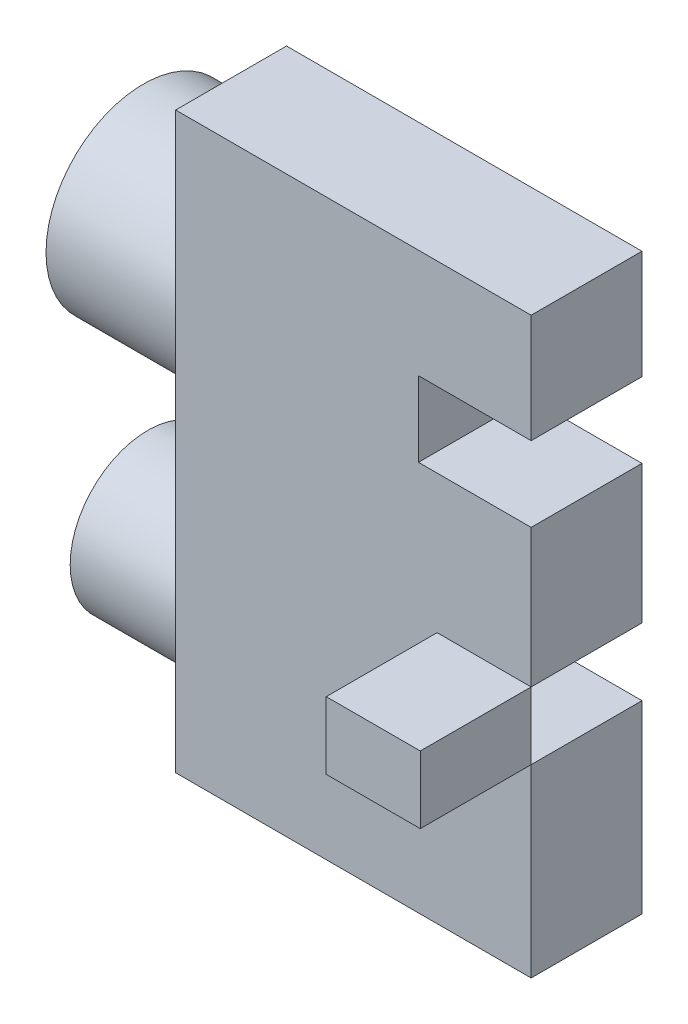
ISO-10303-21;
HEADER;
FILE_DESCRIPTION(('STEP AP214'),'2;1');
FILE_NAME('part.step','',(''),(''),'','','');
FILE_SCHEMA(('AUTOMOTIVE_DESIGN { 1 0 10303 214 1 1 1 1 }'));
ENDSEC;
DATA;
#1=APPLICATION_CONTEXT('core data for automotive mechanical design processes');
#2=APPLICATION_PROTOCOL_DEFINITION('international standard','automotive_design',2000,#1);
#3=PRODUCT_CONTEXT('',#1,'mechanical');
#4=PRODUCT('Part','Part','',(#3));
#5=PRODUCT_RELATED_PRODUCT_CATEGORY('part','',(#4));
#6=PRODUCT_DEFINITION_FORMATION('','',#4);
#7=PRODUCT_DEFINITION_CONTEXT('part definition',#1,'design');
#8=PRODUCT_DEFINITION('design','',#6,#7);
#9=PRODUCT_DEFINITION_SHAPE('','',#8);
#10=(LENGTH_UNIT() NAMED_UNIT(*) SI_UNIT(.MILLI.,.METRE.));
#11=(NAMED_UNIT(*) PLANE_ANGLE_UNIT() SI_UNIT($,.RADIAN.));
#12=(NAMED_UNIT(*) SI_UNIT($,.STERADIAN.) SOLID_ANGLE_UNIT());
#13=UNCERTAINTY_MEASURE_WITH_UNIT(LENGTH_MEASURE(1.E-05),#10,'distance_accuracy_value','');
#14=(GEOMETRIC_REPRESENTATION_CONTEXT(3) GLOBAL_UNCERTAINTY_ASSIGNED_CONTEXT((#13)) GLOBAL_UNIT_ASSIGNED_CONTEXT((#10,
#11,#12)) REPRESENTATION_CONTEXT('',''));
#15=CARTESIAN_POINT('',(0.,0.,0.));
#16=DIRECTION('',(0.,0.,1.));
#17=DIRECTION('',(1.,0.,0.));
#18=AXIS2_PLACEMENT_3D('',#15,#16,#17);
#19=CARTESIAN_POINT('',(23.5831974555638,0.,20.));
#20=DIRECTION('',(1.,0.,0.));
#21=DIRECTION('',(0.,0.,-1.));
#22=AXIS2_PLACEMENT_3D('',#19,#20,#21);
#23=PLANE('',#22);
#24=DIRECTION('',(0.,-1.,0.));
#25=VECTOR('',#24,1.);
#26=CARTESIAN_POINT('',(23.5831974555638,0.,10.));
#27=LINE('',#26,#25);
#28=CARTESIAN_POINT('',(23.5831974555638,22.738119592874,10.));
#29=VERTEX_POINT('',#28);
#30=CARTESIAN_POINT('',(23.5831974555638,16.6677298290869,10.));
#31=VERTEX_POINT('',#30);
#32=EDGE_CURVE('E114',#29,#31,#27,.T.);
#33=ORIENTED_EDGE('',*,*,#32,.T.);
#34=DIRECTION('',(0.,0.,-1.));
#35=VECTOR('',#34,1.);
#36=CARTESIAN_POINT('',(23.5831974555638,16.6677298290869,20.));
#37=LINE('',#36,#35);
#38=CARTESIAN_POINT('',(23.5831974555638,16.6677298290869,20.));
#39=VERTEX_POINT('',#38);
#40=EDGE_CURVE('E12',#39,#31,#37,.T.);
#41=ORIENTED_EDGE('',*,*,#40,.F.);
#42=DIRECTION('',(0.,-1.,0.));
#43=VECTOR('',#42,1.);
#44=CARTESIAN_POINT('',(23.5831974555638,0.,20.));
#45=LINE('',#44,#43);
#46=CARTESIAN_POINT('',(23.5831974555638,22.738119592874,20.));
#47=VERTEX_POINT('',#46);
#48=EDGE_CURVE('E100',#47,#39,#45,.T.);
#49=ORIENTED_EDGE('',*,*,#48,.F.);
#50=DIRECTION('',(0.,0.,-1.));
#51=VECTOR('',#50,1.);
#52=CARTESIAN_POINT('',(23.5831974555638,22.738119592874,20.));
#53=LINE('',#52,#51);
#54=EDGE_CURVE('E67',#47,#29,#53,.T.);
#55=ORIENTED_EDGE('',*,*,#54,.T.);
#56=EDGE_LOOP('',(#33,#41,#49,#55));
#57=FACE_BOUND('',#56,.T.);
#58=ADVANCED_FACE('F51',(#57),#23,.F.);
#59=CARTESIAN_POINT('',(0.,16.6677298290869,20.));
#60=DIRECTION('',(0.,1.,0.));
#61=DIRECTION('',(0.,0.,1.));
#62=AXIS2_PLACEMENT_3D('',#59,#60,#61);
#63=PLANE('',#62);
#64=DIRECTION('',(1.,0.,0.));
#65=VECTOR('',#64,1.);
#66=CARTESIAN_POINT('',(0.,16.6677298290869,10.));
#67=LINE('',#66,#65);
#68=CARTESIAN_POINT('',(32.0668673524223,16.6677298290869,10.));
#69=VERTEX_POINT('',#68);
#70=EDGE_CURVE('E105',#31,#69,#67,.T.);
#71=ORIENTED_EDGE('',*,*,#70,.T.);
#72=DIRECTION('',(0.,0.,-1.));
#73=VECTOR('',#72,1.);
#74=CARTESIAN_POINT('',(32.0668673524223,16.6677298290869,20.));
#75=LINE('',#74,#73);
#76=CARTESIAN_POINT('',(32.0668673524223,16.6677298290869,20.));
#77=VERTEX_POINT('',#76);
#78=EDGE_CURVE('E59',#77,#69,#75,.T.);
#79=ORIENTED_EDGE('',*,*,#78,.F.);
#80=DIRECTION('',(1.,0.,0.));
#81=VECTOR('',#80,1.);
#82=CARTESIAN_POINT('',(0.,16.6677298290869,20.));
#83=LINE('',#82,#81);
#84=EDGE_CURVE('E93',#39,#77,#83,.T.);
#85=ORIENTED_EDGE('',*,*,#84,.F.);
#86=ORIENTED_EDGE('',*,*,#40,.T.);
#87=EDGE_LOOP('',(#71,#79,#85,#86));
#88=FACE_BOUND('',#87,.T.);
#89=ADVANCED_FACE('F104',(#88),#63,.F.);
#90=CARTESIAN_POINT('',(32.0668673524223,0.,20.));
#91=DIRECTION('',(-1.,0.,0.));
#92=DIRECTION('',(0.,0.,1.));
#93=AXIS2_PLACEMENT_3D('',#90,#91,#92);
#94=PLANE('',#93);
#95=DIRECTION('',(0.,1.,0.));
#96=VECTOR('',#95,1.);
#97=CARTESIAN_POINT('',(32.0668673524223,0.,10.));
#98=LINE('',#97,#96);
#99=CARTESIAN_POINT('',(32.0668673524223,22.738119592874,10.));
#100=VERTEX_POINT('',#99);
#101=EDGE_CURVE('E117',#69,#100,#98,.T.);
#102=ORIENTED_EDGE('',*,*,#101,.T.);
#103=DIRECTION('',(0.,0.,-1.));
#104=VECTOR('',#103,1.);
#105=CARTESIAN_POINT('',(32.0668673524223,22.738119592874,20.));
#106=LINE('',#105,#104);
#107=CARTESIAN_POINT('',(32.0668673524223,22.738119592874,20.));
#108=VERTEX_POINT('',#107);
#109=EDGE_CURVE('E82',#108,#100,#106,.T.);
#110=ORIENTED_EDGE('',*,*,#109,.F.);
#111=DIRECTION('',(0.,1.,0.));
#112=VECTOR('',#111,1.);
#113=CARTESIAN_POINT('',(32.0668673524223,0.,20.));
#114=LINE('',#113,#112);
#115=EDGE_CURVE('E99',#77,#108,#114,.T.);
#116=ORIENTED_EDGE('',*,*,#115,.F.);
#117=ORIENTED_EDGE('',*,*,#78,.T.);
#118=EDGE_LOOP('',(#102,#110,#116,#117));
#119=FACE_BOUND('',#118,.T.);
#120=ADVANCED_FACE('F108',(#119),#94,.F.);
#121=CARTESIAN_POINT('',(0.,22.738119592874,20.));
#122=DIRECTION('',(0.,1.,0.));
#123=DIRECTION('',(0.,0.,1.));
#124=AXIS2_PLACEMENT_3D('',#121,#122,#123);
#125=PLANE('',#124);
#126=DIRECTION('',(1.,0.,0.));
#127=VECTOR('',#126,1.);
#128=CARTESIAN_POINT('',(0.,22.738119592874,10.));
#129=LINE('',#128,#127);
#130=EDGE_CURVE('E119',#29,#100,#129,.T.);
#131=ORIENTED_EDGE('',*,*,#130,.F.);
#132=ORIENTED_EDGE('',*,*,#54,.F.);
#133=DIRECTION('',(1.,0.,0.));
#134=VECTOR('',#133,1.);
#135=CARTESIAN_POINT('',(0.,22.738119592874,20.));
#136=LINE('',#135,#134);
#137=EDGE_CURVE('E109',#47,#108,#136,.T.);
#138=ORIENTED_EDGE('',*,*,#137,.T.);
#139=ORIENTED_EDGE('',*,*,#109,.T.);
#140=EDGE_LOOP('',(#131,#132,#138,#139));
#141=FACE_BOUND('',#140,.T.);
#142=ADVANCED_FACE('F125',(#141),#125,.T.);
#143=CARTESIAN_POINT('',(0.,0.,20.));
#144=DIRECTION('',(0.,0.,1.));
#145=DIRECTION('',(1.,0.,0.));
#146=AXIS2_PLACEMENT_3D('',#143,#144,#145);
#147=PLANE('',#146);
#148=ORIENTED_EDGE('',*,*,#48,.T.);
#149=ORIENTED_EDGE('',*,*,#84,.T.);
#150=ORIENTED_EDGE('',*,*,#115,.T.);
#151=ORIENTED_EDGE('',*,*,#137,.F.);
#152=EDGE_LOOP('',(#148,#149,#150,#151));
#153=FACE_BOUND('',#152,.T.);
#154=ADVANCED_FACE('F96',(#153),#147,.T.);
#155=CARTESIAN_POINT('',(0.,0.,10.));
#156=DIRECTION('',(0.,0.,1.));
#157=DIRECTION('',(1.,0.,0.));
#158=AXIS2_PLACEMENT_3D('',#155,#156,#157);
#159=PLANE('',#158);
#160=ORIENTED_EDGE('',*,*,#32,.F.);
#161=ORIENTED_EDGE('',*,*,#130,.T.);
#162=ORIENTED_EDGE('',*,*,#101,.F.);
#163=ORIENTED_EDGE('',*,*,#70,.F.);
#164=EDGE_LOOP('',(#160,#161,#162,#163));
#165=FACE_BOUND('',#164,.T.);
#166=ADVANCED_FACE('F124',(#165),#159,.F.);
#167=CLOSED_SHELL('',(#58,#89,#120,#142,#154,#166));
#168=MANIFOLD_SOLID_BREP('B2',#167);
#169=CARTESIAN_POINT('',(32.0668673524223,51.7801054789113,10.));
#170=DIRECTION('',(-1.,0.,0.));
#171=DIRECTION('',(0.,0.,1.));
#172=AXIS2_PLACEMENT_3D('',#169,#170,#171);
#173=PLANE('',#172);
#174=DIRECTION('',(0.,0.,1.));
#175=VECTOR('',#174,1.);
#176=CARTESIAN_POINT('',(32.0668673524223,41.9765856134915,0.));
#177=LINE('',#176,#175);
#178=CARTESIAN_POINT('',(32.0668673524223,41.9765856134915,0.));
#179=VERTEX_POINT('',#178);
#180=CARTESIAN_POINT('',(32.0668673524223,41.9765856134915,10.));
#181=VERTEX_POINT('',#180);
#182=EDGE_CURVE('E322',#179,#181,#177,.T.);
#183=ORIENTED_EDGE('',*,*,#182,.F.);
#184=DIRECTION('',(0.,1.,0.));
#185=VECTOR('',#184,1.);
#186=CARTESIAN_POINT('',(32.0668673524223,51.7801054789113,0.));
#187=LINE('',#186,#185);
#188=CARTESIAN_POINT('',(32.0668673524223,51.7801054789113,0.));
#189=VERTEX_POINT('',#188);
#190=EDGE_CURVE('E399',#179,#189,#187,.T.);
#191=ORIENTED_EDGE('',*,*,#190,.T.);
#192=DIRECTION('',(0.,0.,-1.));
#193=VECTOR('',#192,1.);
#194=CARTESIAN_POINT('',(32.0668673524223,51.7801054789113,10.));
#195=LINE('',#194,#193);
#196=CARTESIAN_POINT('',(32.0668673524223,51.7801054789113,10.));
#197=VERTEX_POINT('',#196);
#198=EDGE_CURVE('E410',#197,#189,#195,.T.);
#199=ORIENTED_EDGE('',*,*,#198,.F.);
#200=DIRECTION('',(0.,1.,0.));
#201=VECTOR('',#200,1.);
#202=CARTESIAN_POINT('',(32.0668673524223,51.7801054789113,10.));
#203=LINE('',#202,#201);
#204=EDGE_CURVE('E382',#181,#197,#203,.T.);
#205=ORIENTED_EDGE('',*,*,#204,.F.);
#206=EDGE_LOOP('',(#183,#191,#199,#205));
#207=FACE_BOUND('',#206,.T.);
#208=ADVANCED_FACE('F178',(#207),#173,.F.);
#209=CARTESIAN_POINT('',(32.0668673524223,22.738119592874,0.));
#210=VERTEX_POINT('',#209);
#211=CARTESIAN_POINT('',(32.0668673524223,35.2057662615751,0.));
#212=VERTEX_POINT('',#211);
#213=EDGE_CURVE('E404',#210,#212,#187,.T.);
#214=ORIENTED_EDGE('',*,*,#213,.T.);
#215=DIRECTION('',(0.,0.,1.));
#216=VECTOR('',#215,1.);
#217=CARTESIAN_POINT('',(32.0668673524223,35.2057662615751,0.));
#218=LINE('',#217,#216);
#219=CARTESIAN_POINT('',(32.0668673524223,35.2057662615751,10.));
#220=VERTEX_POINT('',#219);
#221=EDGE_CURVE('E204',#212,#220,#218,.T.);
#222=ORIENTED_EDGE('',*,*,#221,.T.);
#223=CARTESIAN_POINT('',(32.0668673524223,22.738119592874,10.));
#224=VERTEX_POINT('',#223);
#225=EDGE_CURVE('E388',#224,#220,#203,.T.);
#226=ORIENTED_EDGE('',*,*,#225,.F.);
#227=DIRECTION('',(0.,0.,1.));
#228=VECTOR('',#227,1.);
#229=CARTESIAN_POINT('',(32.0668673524223,22.738119592874,0.));
#230=LINE('',#229,#228);
#231=EDGE_CURVE('E331',#210,#224,#230,.T.);
#232=ORIENTED_EDGE('',*,*,#231,.F.);
#233=EDGE_LOOP('',(#214,#222,#226,#232));
#234=FACE_BOUND('',#233,.T.);
#235=ADVANCED_FACE('F471',(#234),#173,.F.);
#236=CARTESIAN_POINT('',(0.,0.,10.));
#237=DIRECTION('',(0.,0.,-1.));
#238=DIRECTION('',(-1.,0.,0.));
#239=AXIS2_PLACEMENT_3D('',#236,#237,#238);
#240=PLANE('',#239);
#241=DIRECTION('',(1.,0.,0.));
#242=VECTOR('',#241,1.);
#243=CARTESIAN_POINT('',(0.,41.9765856134915,10.));
#244=LINE('',#243,#242);
#245=CARTESIAN_POINT('',(21.9021664440536,41.9765856134915,10.));
#246=VERTEX_POINT('',#245);
#247=EDGE_CURVE('E304',#246,#181,#244,.T.);
#248=ORIENTED_EDGE('',*,*,#247,.T.);
#249=ORIENTED_EDGE('',*,*,#204,.T.);
#250=DIRECTION('',(-1.,0.,0.));
#251=VECTOR('',#250,1.);
#252=CARTESIAN_POINT('',(0.,51.7801054789113,10.));
#253=LINE('',#252,#251);
#254=CARTESIAN_POINT('',(0.,51.7801054789113,10.));
#255=VERTEX_POINT('',#254);
#256=EDGE_CURVE('E387',#197,#255,#253,.T.);
#257=ORIENTED_EDGE('',*,*,#256,.T.);
#258=DIRECTION('',(0.,-1.,0.));
#259=VECTOR('',#258,1.);
#260=CARTESIAN_POINT('',(0.,0.,10.));
#261=LINE('',#260,#259);
#262=CARTESIAN_POINT('',(0.,0.,10.));
#263=VERTEX_POINT('',#262);
#264=EDGE_CURVE('E374',#255,#263,#261,.T.);
#265=ORIENTED_EDGE('',*,*,#264,.T.);
#266=DIRECTION('',(1.,0.,0.));
#267=VECTOR('',#266,1.);
#268=CARTESIAN_POINT('',(0.,0.,10.));
#269=LINE('',#268,#267);
#270=CARTESIAN_POINT('',(32.0668673524223,0.,10.));
#271=VERTEX_POINT('',#270);
#272=EDGE_CURVE('E378',#263,#271,#269,.T.);
#273=ORIENTED_EDGE('',*,*,#272,.T.);
#274=CARTESIAN_POINT('',(32.0668673524223,16.6677298290869,10.));
#275=VERTEX_POINT('',#274);
#276=EDGE_CURVE('E383',#271,#275,#203,.T.);
#277=ORIENTED_EDGE('',*,*,#276,.T.);
#278=DIRECTION('',(1.,0.,0.));
#279=VECTOR('',#278,1.);
#280=CARTESIAN_POINT('',(23.5831974555638,16.6677298290869,10.));
#281=LINE('',#280,#279);
#282=CARTESIAN_POINT('',(23.5831974555638,16.6677298290869,10.));
#283=VERTEX_POINT('',#282);
#284=EDGE_CURVE('E315',#283,#275,#281,.T.);
#285=ORIENTED_EDGE('',*,*,#284,.F.);
#286=DIRECTION('',(0.,-1.,0.));
#287=VECTOR('',#286,1.);
#288=CARTESIAN_POINT('',(23.5831974555638,22.738119592874,10.));
#289=LINE('',#288,#287);
#290=CARTESIAN_POINT('',(23.5831974555638,22.738119592874,10.));
#291=VERTEX_POINT('',#290);
#292=EDGE_CURVE('E340',#291,#283,#289,.T.);
#293=ORIENTED_EDGE('',*,*,#292,.F.);
#294=DIRECTION('',(1.,0.,0.));
#295=VECTOR('',#294,1.);
#296=CARTESIAN_POINT('',(23.5831974555638,22.738119592874,10.));
#297=LINE('',#296,#295);
#298=EDGE_CURVE('E344',#291,#224,#297,.T.);
#299=ORIENTED_EDGE('',*,*,#298,.T.);
#300=ORIENTED_EDGE('',*,*,#225,.T.);
#301=DIRECTION('',(1.,0.,0.));
#302=VECTOR('',#301,1.);
#303=CARTESIAN_POINT('',(0.,35.2057662615751,10.));
#304=LINE('',#303,#302);
#305=CARTESIAN_POINT('',(21.9021664440536,35.2057662615751,10.));
#306=VERTEX_POINT('',#305);
#307=EDGE_CURVE('E308',#306,#220,#304,.T.);
#308=ORIENTED_EDGE('',*,*,#307,.F.);
#309=DIRECTION('',(0.,-1.,0.));
#310=VECTOR('',#309,1.);
#311=CARTESIAN_POINT('',(21.9021664440536,0.,10.));
#312=LINE('',#311,#310);
#313=EDGE_CURVE('E289',#246,#306,#312,.T.);
#314=ORIENTED_EDGE('',*,*,#313,.F.);
#315=EDGE_LOOP('',(#248,#249,#257,#265,#273,#277,#285,#293,#299,#300,#308,#314));
#316=FACE_BOUND('',#315,.T.);
#317=ADVANCED_FACE('F439',(#316),#240,.F.);
#318=CARTESIAN_POINT('',(0.,0.,0.));
#319=DIRECTION('',(0.,0.,-1.));
#320=DIRECTION('',(-1.,0.,0.));
#321=AXIS2_PLACEMENT_3D('',#318,#319,#320);
#322=PLANE('',#321);
#323=ORIENTED_EDGE('',*,*,#190,.F.);
#324=DIRECTION('',(1.,0.,0.));
#325=VECTOR('',#324,1.);
#326=CARTESIAN_POINT('',(0.,41.9765856134915,0.));
#327=LINE('',#326,#325);
#328=CARTESIAN_POINT('',(21.9021664440536,41.9765856134915,0.));
#329=VERTEX_POINT('',#328);
#330=EDGE_CURVE('E292',#329,#179,#327,.T.);
#331=ORIENTED_EDGE('',*,*,#330,.F.);
#332=DIRECTION('',(0.,-1.,0.));
#333=VECTOR('',#332,1.);
#334=CARTESIAN_POINT('',(21.9021664440536,0.,0.));
#335=LINE('',#334,#333);
#336=CARTESIAN_POINT('',(21.9021664440536,35.2057662615751,0.));
#337=VERTEX_POINT('',#336);
#338=EDGE_CURVE('E286',#329,#337,#335,.T.);
#339=ORIENTED_EDGE('',*,*,#338,.T.);
#340=DIRECTION('',(1.,0.,0.));
#341=VECTOR('',#340,1.);
#342=CARTESIAN_POINT('',(0.,35.2057662615751,0.));
#343=LINE('',#342,#341);
#344=EDGE_CURVE('E294',#337,#212,#343,.T.);
#345=ORIENTED_EDGE('',*,*,#344,.T.);
#346=ORIENTED_EDGE('',*,*,#213,.F.);
#347=DIRECTION('',(1.,0.,0.));
#348=VECTOR('',#347,1.);
#349=CARTESIAN_POINT('',(23.5831974555638,22.738119592874,0.));
#350=LINE('',#349,#348);
#351=CARTESIAN_POINT('',(23.5831974555638,22.738119592874,0.));
#352=VERTEX_POINT('',#351);
#353=EDGE_CURVE('E353',#352,#210,#350,.T.);
#354=ORIENTED_EDGE('',*,*,#353,.F.);
#355=DIRECTION('',(0.,-1.,0.));
#356=VECTOR('',#355,1.);
#357=CARTESIAN_POINT('',(23.5831974555638,22.738119592874,0.));
#358=LINE('',#357,#356);
#359=CARTESIAN_POINT('',(23.5831974555638,16.6677298290869,0.));
#360=VERTEX_POINT('',#359);
#361=EDGE_CURVE('E196',#352,#360,#358,.T.);
#362=ORIENTED_EDGE('',*,*,#361,.T.);
#363=DIRECTION('',(1.,0.,0.));
#364=VECTOR('',#363,1.);
#365=CARTESIAN_POINT('',(23.5831974555638,16.6677298290869,0.));
#366=LINE('',#365,#364);
#367=CARTESIAN_POINT('',(32.0668673524223,16.6677298290869,0.));
#368=VERTEX_POINT('',#367);
#369=EDGE_CURVE('E345',#360,#368,#366,.T.);
#370=ORIENTED_EDGE('',*,*,#369,.T.);
#371=CARTESIAN_POINT('',(32.0668673524223,0.,0.));
#372=VERTEX_POINT('',#371);
#373=EDGE_CURVE('E400',#372,#368,#187,.T.);
#374=ORIENTED_EDGE('',*,*,#373,.F.);
#375=DIRECTION('',(1.,0.,0.));
#376=VECTOR('',#375,1.);
#377=CARTESIAN_POINT('',(0.,0.,0.));
#378=LINE('',#377,#376);
#379=CARTESIAN_POINT('',(0.,0.,0.));
#380=VERTEX_POINT('',#379);
#381=EDGE_CURVE('E395',#380,#372,#378,.T.);
#382=ORIENTED_EDGE('',*,*,#381,.F.);
#383=DIRECTION('',(0.,-1.,0.));
#384=VECTOR('',#383,1.);
#385=CARTESIAN_POINT('',(0.,0.,0.));
#386=LINE('',#385,#384);
#387=CARTESIAN_POINT('',(0.,1.49175541961911,0.));
#388=VERTEX_POINT('',#387);
#389=EDGE_CURVE('E373',#388,#380,#386,.T.);
#390=ORIENTED_EDGE('',*,*,#389,.F.);
#391=CARTESIAN_POINT('',(0.,15.5003471822047,0.));
#392=VERTEX_POINT('',#391);
#393=EDGE_CURVE('E433',#392,#388,#386,.T.);
#394=ORIENTED_EDGE('',*,*,#393,.F.);
#395=CARTESIAN_POINT('',(0.,24.7927130513864,0.));
#396=VERTEX_POINT('',#395);
#397=EDGE_CURVE('E452',#396,#392,#386,.T.);
#398=ORIENTED_EDGE('',*,*,#397,.F.);
#399=CARTESIAN_POINT('',(0.,42.3501480604937,0.));
#400=VERTEX_POINT('',#399);
#401=EDGE_CURVE('E396',#400,#396,#386,.T.);
#402=ORIENTED_EDGE('',*,*,#401,.F.);
#403=CARTESIAN_POINT('',(0.,51.7801054789113,0.));
#404=VERTEX_POINT('',#403);
#405=EDGE_CURVE('E392',#404,#400,#386,.T.);
#406=ORIENTED_EDGE('',*,*,#405,.F.);
#407=DIRECTION('',(-1.,0.,0.));
#408=VECTOR('',#407,1.);
#409=CARTESIAN_POINT('',(0.,51.7801054789113,0.));
#410=LINE('',#409,#408);
#411=EDGE_CURVE('E379',#189,#404,#410,.T.);
#412=ORIENTED_EDGE('',*,*,#411,.F.);
#413=EDGE_LOOP('',(#323,#331,#339,#345,#346,#354,#362,#370,#374,#382,#390,#394,#398,#402,#406,#412));
#414=FACE_BOUND('',#413,.T.);
#415=ADVANCED_FACE('F302',(#414),#322,.T.);
#416=CARTESIAN_POINT('',(0.,0.,10.));
#417=DIRECTION('',(1.,0.,0.));
#418=DIRECTION('',(0.,0.,-1.));
#419=AXIS2_PLACEMENT_3D('',#416,#417,#418);
#420=PLANE('',#419);
#421=CARTESIAN_POINT('',(0.,8.4960513009119,0.));
#422=DIRECTION('',(-1.,0.,0.));
#423=DIRECTION('',(0.,0.,1.));
#424=AXIS2_PLACEMENT_3D('',#421,#422,#423);
#425=CIRCLE('',#424,7.00429588129279);
#426=EDGE_CURVE('E321',#388,#392,#425,.T.);
#427=ORIENTED_EDGE('',*,*,#426,.F.);
#428=ORIENTED_EDGE('',*,*,#389,.T.);
#429=DIRECTION('',(0.,0.,-1.));
#430=VECTOR('',#429,1.);
#431=CARTESIAN_POINT('',(0.,0.,10.));
#432=LINE('',#431,#430);
#433=EDGE_CURVE('E182',#263,#380,#432,.T.);
#434=ORIENTED_EDGE('',*,*,#433,.F.);
#435=ORIENTED_EDGE('',*,*,#264,.F.);
#436=DIRECTION('',(0.,0.,-1.));
#437=VECTOR('',#436,1.);
#438=CARTESIAN_POINT('',(0.,51.7801054789113,10.));
#439=LINE('',#438,#437);
#440=EDGE_CURVE('E391',#255,#404,#439,.T.);
#441=ORIENTED_EDGE('',*,*,#440,.T.);
#442=ORIENTED_EDGE('',*,*,#405,.T.);
#443=CARTESIAN_POINT('',(0.,33.5714305559401,0.));
#444=DIRECTION('',(-1.,0.,0.));
#445=DIRECTION('',(0.,0.,1.));
#446=AXIS2_PLACEMENT_3D('',#443,#444,#445);
#447=CIRCLE('',#446,8.77871750455363);
#448=EDGE_CURVE('E49',#396,#400,#447,.T.);
#449=ORIENTED_EDGE('',*,*,#448,.F.);
#450=ORIENTED_EDGE('',*,*,#397,.T.);
#451=EDGE_LOOP('',(#427,#428,#434,#435,#441,#442,#449,#450));
#452=FACE_BOUND('',#451,.T.);
#453=ADVANCED_FACE('F180',(#452),#420,.F.);
#454=CARTESIAN_POINT('',(0.,0.,10.));
#455=DIRECTION('',(0.,1.,0.));
#456=DIRECTION('',(0.,0.,1.));
#457=AXIS2_PLACEMENT_3D('',#454,#455,#456);
#458=PLANE('',#457);
#459=ORIENTED_EDGE('',*,*,#381,.T.);
#460=DIRECTION('',(0.,0.,-1.));
#461=VECTOR('',#460,1.);
#462=CARTESIAN_POINT('',(32.0668673524223,0.,10.));
#463=LINE('',#462,#461);
#464=EDGE_CURVE('E413',#271,#372,#463,.T.);
#465=ORIENTED_EDGE('',*,*,#464,.F.);
#466=ORIENTED_EDGE('',*,*,#272,.F.);
#467=ORIENTED_EDGE('',*,*,#433,.T.);
#468=EDGE_LOOP('',(#459,#465,#466,#467));
#469=FACE_BOUND('',#468,.T.);
#470=ADVANCED_FACE('F424',(#469),#458,.F.);
#471=ORIENTED_EDGE('',*,*,#373,.T.);
#472=DIRECTION('',(0.,0.,1.));
#473=VECTOR('',#472,1.);
#474=CARTESIAN_POINT('',(32.0668673524223,16.6677298290869,0.));
#475=LINE('',#474,#473);
#476=EDGE_CURVE('E327',#368,#275,#475,.T.);
#477=ORIENTED_EDGE('',*,*,#476,.T.);
#478=ORIENTED_EDGE('',*,*,#276,.F.);
#479=ORIENTED_EDGE('',*,*,#464,.T.);
#480=EDGE_LOOP('',(#471,#477,#478,#479));
#481=FACE_BOUND('',#480,.T.);
#482=ADVANCED_FACE('F435',(#481),#173,.F.);
#483=CARTESIAN_POINT('',(0.,51.7801054789113,10.));
#484=DIRECTION('',(0.,-1.,0.));
#485=DIRECTION('',(0.,0.,-1.));
#486=AXIS2_PLACEMENT_3D('',#483,#484,#485);
#487=PLANE('',#486);
#488=ORIENTED_EDGE('',*,*,#411,.T.);
#489=ORIENTED_EDGE('',*,*,#440,.F.);
#490=ORIENTED_EDGE('',*,*,#256,.F.);
#491=ORIENTED_EDGE('',*,*,#198,.T.);
#492=EDGE_LOOP('',(#488,#489,#490,#491));
#493=FACE_BOUND('',#492,.T.);
#494=ADVANCED_FACE('F446',(#493),#487,.F.);
#495=CARTESIAN_POINT('',(0.,33.5714305559401,0.));
#496=DIRECTION('',(-1.,0.,0.));
#497=DIRECTION('',(0.,0.,1.));
#498=AXIS2_PLACEMENT_3D('',#495,#496,#497);
#499=PLANE('',#498);
#500=EDGE_CURVE('E189',#400,#396,#447,.T.);
#501=ORIENTED_EDGE('',*,*,#500,.F.);
#502=ORIENTED_EDGE('',*,*,#401,.T.);
#503=EDGE_LOOP('',(#501,#502));
#504=FACE_BOUND('',#503,.T.);
#505=ADVANCED_FACE('F458',(#504),#499,.F.);
#506=CARTESIAN_POINT('',(-12.9176559664658,33.5714305559401,0.));
#507=DIRECTION('',(-1.,0.,0.));
#508=DIRECTION('',(0.,0.,1.));
#509=AXIS2_PLACEMENT_3D('',#506,#507,#508);
#510=CYLINDRICAL_SURFACE('',#509,8.77871750455363);
#511=CARTESIAN_POINT('',(-12.9176559664658,33.5714305559401,0.));
#512=DIRECTION('',(-1.,0.,0.));
#513=DIRECTION('',(0.,0.,1.));
#514=AXIS2_PLACEMENT_3D('',#511,#512,#513);
#515=CIRCLE('',#514,8.77871750455363);
#516=CARTESIAN_POINT('',(-12.9176559664658,33.5714305559401,8.77871750455363));
#517=VERTEX_POINT('',#516);
#518=EDGE_CURVE('E367',#517,#517,#515,.T.);
#519=ORIENTED_EDGE('',*,*,#518,.F.);
#520=EDGE_LOOP('',(#519));
#521=FACE_BOUND('',#520,.T.);
#522=ORIENTED_EDGE('',*,*,#500,.T.);
#523=ORIENTED_EDGE('',*,*,#448,.T.);
#524=EDGE_LOOP('',(#522,#523));
#525=FACE_BOUND('',#524,.T.);
#526=ADVANCED_FACE('F457',(#521,#525),#510,.T.);
#527=CARTESIAN_POINT('',(-12.9176559664658,42.3501480604937,0.));
#528=DIRECTION('',(1.,0.,0.));
#529=DIRECTION('',(0.,0.,-1.));
#530=AXIS2_PLACEMENT_3D('',#527,#528,#529);
#531=PLANE('',#530);
#532=ORIENTED_EDGE('',*,*,#518,.T.);
#533=EDGE_LOOP('',(#532));
#534=FACE_BOUND('',#533,.T.);
#535=ADVANCED_FACE('F465',(#534),#531,.F.);
#536=CARTESIAN_POINT('',(-12.5122739860317,15.5003471822047,0.));
#537=DIRECTION('',(1.,0.,0.));
#538=DIRECTION('',(0.,0.,-1.));
#539=AXIS2_PLACEMENT_3D('',#536,#537,#538);
#540=PLANE('',#539);
#541=CARTESIAN_POINT('',(-12.5122739860317,8.4960513009119,0.));
#542=DIRECTION('',(-1.,0.,0.));
#543=DIRECTION('',(0.,0.,1.));
#544=AXIS2_PLACEMENT_3D('',#541,#542,#543);
#545=CIRCLE('',#544,7.00429588129279);
#546=CARTESIAN_POINT('',(-12.5122739860317,8.4960513009119,7.00429588129279));
#547=VERTEX_POINT('',#546);
#548=EDGE_CURVE('E363',#547,#547,#545,.T.);
#549=ORIENTED_EDGE('',*,*,#548,.T.);
#550=EDGE_LOOP('',(#549));
#551=FACE_BOUND('',#550,.T.);
#552=ADVANCED_FACE('F527',(#551),#540,.F.);
#553=CARTESIAN_POINT('',(-12.5122739860317,8.4960513009119,0.));
#554=DIRECTION('',(-1.,0.,0.));
#555=DIRECTION('',(0.,0.,1.));
#556=AXIS2_PLACEMENT_3D('',#553,#554,#555);
#557=CYLINDRICAL_SURFACE('',#556,7.00429588129279);
#558=ORIENTED_EDGE('',*,*,#548,.F.);
#559=EDGE_LOOP('',(#558));
#560=FACE_BOUND('',#559,.T.);
#561=EDGE_CURVE('E359',#392,#388,#425,.T.);
#562=ORIENTED_EDGE('',*,*,#561,.T.);
#563=ORIENTED_EDGE('',*,*,#426,.T.);
#564=EDGE_LOOP('',(#562,#563));
#565=FACE_BOUND('',#564,.T.);
#566=ADVANCED_FACE('F515',(#560,#565),#557,.T.);
#567=CARTESIAN_POINT('',(0.,15.5003471822047,0.));
#568=DIRECTION('',(-1.,0.,0.));
#569=DIRECTION('',(0.,0.,1.));
#570=AXIS2_PLACEMENT_3D('',#567,#568,#569);
#571=PLANE('',#570);
#572=ORIENTED_EDGE('',*,*,#393,.T.);
#573=ORIENTED_EDGE('',*,*,#561,.F.);
#574=EDGE_LOOP('',(#572,#573));
#575=FACE_BOUND('',#574,.T.);
#576=ADVANCED_FACE('F509',(#575),#571,.F.);
#577=CARTESIAN_POINT('',(23.5831974555638,16.6677298290869,0.));
#578=DIRECTION('',(0.,-1.,0.));
#579=DIRECTION('',(0.,0.,-1.));
#580=AXIS2_PLACEMENT_3D('',#577,#578,#579);
#581=PLANE('',#580);
#582=ORIENTED_EDGE('',*,*,#284,.T.);
#583=ORIENTED_EDGE('',*,*,#476,.F.);
#584=ORIENTED_EDGE('',*,*,#369,.F.);
#585=DIRECTION('',(0.,0.,1.));
#586=VECTOR('',#585,1.);
#587=CARTESIAN_POINT('',(23.5831974555638,16.6677298290869,0.));
#588=LINE('',#587,#586);
#589=EDGE_CURVE('E337',#360,#283,#588,.T.);
#590=ORIENTED_EDGE('',*,*,#589,.T.);
#591=EDGE_LOOP('',(#582,#583,#584,#590));
#592=FACE_BOUND('',#591,.T.);
#593=ADVANCED_FACE('F514',(#592),#581,.F.);
#594=CARTESIAN_POINT('',(23.5831974555638,22.738119592874,0.));
#595=DIRECTION('',(-1.,0.,0.));
#596=DIRECTION('',(0.,0.,1.));
#597=AXIS2_PLACEMENT_3D('',#594,#595,#596);
#598=PLANE('',#597);
#599=ORIENTED_EDGE('',*,*,#292,.T.);
#600=ORIENTED_EDGE('',*,*,#589,.F.);
#601=ORIENTED_EDGE('',*,*,#361,.F.);
#602=DIRECTION('',(0.,0.,1.));
#603=VECTOR('',#602,1.);
#604=CARTESIAN_POINT('',(23.5831974555638,22.738119592874,0.));
#605=LINE('',#604,#603);
#606=EDGE_CURVE('E334',#352,#291,#605,.T.);
#607=ORIENTED_EDGE('',*,*,#606,.T.);
#608=EDGE_LOOP('',(#599,#600,#601,#607));
#609=FACE_BOUND('',#608,.T.);
#610=ADVANCED_FACE('F582',(#609),#598,.F.);
#611=CARTESIAN_POINT('',(23.5831974555638,22.738119592874,0.));
#612=DIRECTION('',(0.,-1.,0.));
#613=DIRECTION('',(0.,0.,-1.));
#614=AXIS2_PLACEMENT_3D('',#611,#612,#613);
#615=PLANE('',#614);
#616=ORIENTED_EDGE('',*,*,#298,.F.);
#617=ORIENTED_EDGE('',*,*,#606,.F.);
#618=ORIENTED_EDGE('',*,*,#353,.T.);
#619=ORIENTED_EDGE('',*,*,#231,.T.);
#620=EDGE_LOOP('',(#616,#617,#618,#619));
#621=FACE_BOUND('',#620,.T.);
#622=ADVANCED_FACE('F591',(#621),#615,.T.);
#623=CARTESIAN_POINT('',(21.9021664440536,0.,0.));
#624=DIRECTION('',(-1.,0.,0.));
#625=DIRECTION('',(0.,0.,1.));
#626=AXIS2_PLACEMENT_3D('',#623,#624,#625);
#627=PLANE('',#626);
#628=ORIENTED_EDGE('',*,*,#313,.T.);
#629=DIRECTION('',(0.,0.,1.));
#630=VECTOR('',#629,1.);
#631=CARTESIAN_POINT('',(21.9021664440536,35.2057662615751,0.));
#632=LINE('',#631,#630);
#633=EDGE_CURVE('E283',#337,#306,#632,.T.);
#634=ORIENTED_EDGE('',*,*,#633,.F.);
#635=ORIENTED_EDGE('',*,*,#338,.F.);
#636=DIRECTION('',(0.,0.,1.));
#637=VECTOR('',#636,1.);
#638=CARTESIAN_POINT('',(21.9021664440536,41.9765856134915,0.));
#639=LINE('',#638,#637);
#640=EDGE_CURVE('E318',#329,#246,#639,.T.);
#641=ORIENTED_EDGE('',*,*,#640,.T.);
#642=EDGE_LOOP('',(#628,#634,#635,#641));
#643=FACE_BOUND('',#642,.T.);
#644=ADVANCED_FACE('F284',(#643),#627,.F.);
#645=CARTESIAN_POINT('',(0.,41.9765856134915,0.));
#646=DIRECTION('',(0.,-1.,0.));
#647=DIRECTION('',(0.,0.,-1.));
#648=AXIS2_PLACEMENT_3D('',#645,#646,#647);
#649=PLANE('',#648);
#650=ORIENTED_EDGE('',*,*,#247,.F.);
#651=ORIENTED_EDGE('',*,*,#640,.F.);
#652=ORIENTED_EDGE('',*,*,#330,.T.);
#653=ORIENTED_EDGE('',*,*,#182,.T.);
#654=EDGE_LOOP('',(#650,#651,#652,#653));
#655=FACE_BOUND('',#654,.T.);
#656=ADVANCED_FACE('F609',(#655),#649,.T.);
#657=CARTESIAN_POINT('',(0.,35.2057662615751,0.));
#658=DIRECTION('',(0.,-1.,0.));
#659=DIRECTION('',(0.,0.,-1.));
#660=AXIS2_PLACEMENT_3D('',#657,#658,#659);
#661=PLANE('',#660);
#662=ORIENTED_EDGE('',*,*,#307,.T.);
#663=ORIENTED_EDGE('',*,*,#221,.F.);
#664=ORIENTED_EDGE('',*,*,#344,.F.);
#665=ORIENTED_EDGE('',*,*,#633,.T.);
#666=EDGE_LOOP('',(#662,#663,#664,#665));
#667=FACE_BOUND('',#666,.T.);
#668=ADVANCED_FACE('F295',(#667),#661,.F.);
#669=CLOSED_SHELL('',(#208,#235,#317,#415,#453,#470,#482,#494,#505,#526,#535,#552,#566,#576,
#593,#610,#622,#644,#656,#668));
#670=MANIFOLD_SOLID_BREP('B6',#669);
#671=ADVANCED_BREP_SHAPE_REPRESENTATION('',(#18,#168,#670),#14);
#672=SHAPE_DEFINITION_REPRESENTATION(#9,#671);
ENDSEC;
END-ISO-10303-21;
